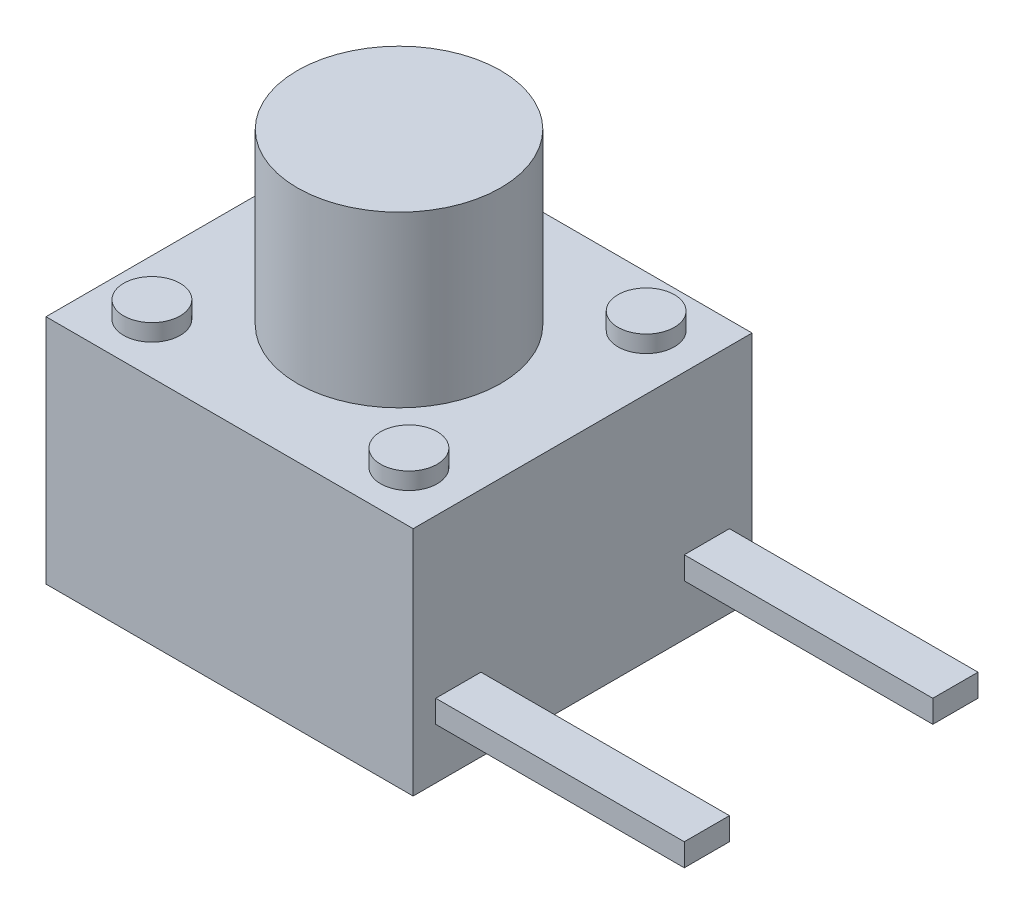
ISO-10303-21;
HEADER;
FILE_DESCRIPTION(('STEP AP214'),'2;1');
FILE_NAME('part.step','',(''),(''),'','','');
FILE_SCHEMA(('AUTOMOTIVE_DESIGN { 1 0 10303 214 1 1 1 1 }'));
ENDSEC;
DATA;
#1=APPLICATION_CONTEXT('core data for automotive mechanical design processes');
#2=APPLICATION_PROTOCOL_DEFINITION('international standard','automotive_design',2000,#1);
#3=PRODUCT_CONTEXT('',#1,'mechanical');
#4=PRODUCT('Part','Part','',(#3));
#5=PRODUCT_RELATED_PRODUCT_CATEGORY('part','',(#4));
#6=PRODUCT_DEFINITION_FORMATION('','',#4);
#7=PRODUCT_DEFINITION_CONTEXT('part definition',#1,'design');
#8=PRODUCT_DEFINITION('design','',#6,#7);
#9=PRODUCT_DEFINITION_SHAPE('','',#8);
#10=(LENGTH_UNIT() NAMED_UNIT(*) SI_UNIT(.MILLI.,.METRE.));
#11=(NAMED_UNIT(*) PLANE_ANGLE_UNIT() SI_UNIT($,.RADIAN.));
#12=(NAMED_UNIT(*) SI_UNIT($,.STERADIAN.) SOLID_ANGLE_UNIT());
#13=UNCERTAINTY_MEASURE_WITH_UNIT(LENGTH_MEASURE(1.E-05),#10,'distance_accuracy_value','');
#14=(GEOMETRIC_REPRESENTATION_CONTEXT(3) GLOBAL_UNCERTAINTY_ASSIGNED_CONTEXT((#13)) GLOBAL_UNIT_ASSIGNED_CONTEXT((#10,
#11,#12)) REPRESENTATION_CONTEXT('',''));
#15=CARTESIAN_POINT('',(0.,0.,0.));
#16=DIRECTION('',(0.,0.,1.));
#17=DIRECTION('',(1.,0.,0.));
#18=AXIS2_PLACEMENT_3D('',#15,#16,#17);
#19=CARTESIAN_POINT('',(-3.25,4.1,3.));
#20=DIRECTION('',(-1.,0.,0.));
#21=DIRECTION('',(0.,0.,1.));
#22=AXIS2_PLACEMENT_3D('',#19,#20,#21);
#23=PLANE('',#22);
#24=DIRECTION('',(0.,0.,-1.));
#25=VECTOR('',#24,1.);
#26=CARTESIAN_POINT('',(-3.25,0.,3.));
#27=LINE('',#26,#25);
#28=CARTESIAN_POINT('',(-3.25,0.,3.));
#29=VERTEX_POINT('',#28);
#30=CARTESIAN_POINT('',(-3.25,0.,-3.));
#31=VERTEX_POINT('',#30);
#32=EDGE_CURVE('E216',#29,#31,#27,.T.);
#33=ORIENTED_EDGE('',*,*,#32,.F.);
#34=DIRECTION('',(0.,-1.,0.));
#35=VECTOR('',#34,1.);
#36=CARTESIAN_POINT('',(-3.25,4.1,3.));
#37=LINE('',#36,#35);
#38=CARTESIAN_POINT('',(-3.25,4.1,3.));
#39=VERTEX_POINT('',#38);
#40=EDGE_CURVE('E42',#39,#29,#37,.T.);
#41=ORIENTED_EDGE('',*,*,#40,.F.);
#42=DIRECTION('',(0.,0.,-1.));
#43=VECTOR('',#42,1.);
#44=CARTESIAN_POINT('',(-3.25,4.1,3.));
#45=LINE('',#44,#43);
#46=CARTESIAN_POINT('',(-3.25,4.1,-3.));
#47=VERTEX_POINT('',#46);
#48=EDGE_CURVE('E218',#39,#47,#45,.T.);
#49=ORIENTED_EDGE('',*,*,#48,.T.);
#50=DIRECTION('',(0.,-1.,0.));
#51=VECTOR('',#50,1.);
#52=CARTESIAN_POINT('',(-3.25,4.1,-3.));
#53=LINE('',#52,#51);
#54=EDGE_CURVE('E37',#47,#31,#53,.T.);
#55=ORIENTED_EDGE('',*,*,#54,.T.);
#56=EDGE_LOOP('',(#33,#41,#49,#55));
#57=FACE_BOUND('',#56,.T.);
#58=ADVANCED_FACE('F34',(#57),#23,.T.);
#59=CARTESIAN_POINT('',(-3.25,4.1,3.));
#60=DIRECTION('',(0.,0.,-1.));
#61=DIRECTION('',(-1.,0.,0.));
#62=AXIS2_PLACEMENT_3D('',#59,#60,#61);
#63=PLANE('',#62);
#64=DIRECTION('',(1.,0.,0.));
#65=VECTOR('',#64,1.);
#66=CARTESIAN_POINT('',(-3.25,0.,3.));
#67=LINE('',#66,#65);
#68=CARTESIAN_POINT('',(3.25,0.,3.));
#69=VERTEX_POINT('',#68);
#70=EDGE_CURVE('E222',#29,#69,#67,.T.);
#71=ORIENTED_EDGE('',*,*,#70,.T.);
#72=DIRECTION('',(0.,-1.,0.));
#73=VECTOR('',#72,1.);
#74=CARTESIAN_POINT('',(3.25,4.1,3.));
#75=LINE('',#74,#73);
#76=CARTESIAN_POINT('',(3.25,4.1,3.));
#77=VERTEX_POINT('',#76);
#78=EDGE_CURVE('E239',#77,#69,#75,.T.);
#79=ORIENTED_EDGE('',*,*,#78,.F.);
#80=DIRECTION('',(1.,0.,0.));
#81=VECTOR('',#80,1.);
#82=CARTESIAN_POINT('',(-3.25,4.1,3.));
#83=LINE('',#82,#81);
#84=EDGE_CURVE('E227',#39,#77,#83,.T.);
#85=ORIENTED_EDGE('',*,*,#84,.F.);
#86=ORIENTED_EDGE('',*,*,#40,.T.);
#87=EDGE_LOOP('',(#71,#79,#85,#86));
#88=FACE_BOUND('',#87,.T.);
#89=ADVANCED_FACE('F256',(#88),#63,.F.);
#90=CARTESIAN_POINT('',(3.25,4.1,3.));
#91=DIRECTION('',(-1.,0.,0.));
#92=DIRECTION('',(0.,0.,1.));
#93=AXIS2_PLACEMENT_3D('',#90,#91,#92);
#94=PLANE('',#93);
#95=DIRECTION('',(0.,0.,-1.));
#96=VECTOR('',#95,1.);
#97=CARTESIAN_POINT('',(3.25,0.899999999999997,-1.8));
#98=LINE('',#97,#96);
#99=CARTESIAN_POINT('',(3.25,0.899999999999997,-1.8));
#100=VERTEX_POINT('',#99);
#101=CARTESIAN_POINT('',(3.25,0.899999999999997,-2.6));
#102=VERTEX_POINT('',#101);
#103=EDGE_CURVE('E132',#100,#102,#98,.T.);
#104=ORIENTED_EDGE('',*,*,#103,.F.);
#105=DIRECTION('',(0.,1.,0.));
#106=VECTOR('',#105,1.);
#107=CARTESIAN_POINT('',(3.25,0.899999999999997,-1.8));
#108=LINE('',#107,#106);
#109=CARTESIAN_POINT('',(3.25,1.3,-1.8));
#110=VERTEX_POINT('',#109);
#111=EDGE_CURVE('E140',#100,#110,#108,.T.);
#112=ORIENTED_EDGE('',*,*,#111,.T.);
#113=DIRECTION('',(0.,0.,-1.));
#114=VECTOR('',#113,1.);
#115=CARTESIAN_POINT('',(3.25,1.3,-1.8));
#116=LINE('',#115,#114);
#117=CARTESIAN_POINT('',(3.25,1.3,-2.6));
#118=VERTEX_POINT('',#117);
#119=EDGE_CURVE('E147',#110,#118,#116,.T.);
#120=ORIENTED_EDGE('',*,*,#119,.T.);
#121=DIRECTION('',(0.,1.,0.));
#122=VECTOR('',#121,1.);
#123=CARTESIAN_POINT('',(3.25,0.899999999999997,-2.6));
#124=LINE('',#123,#122);
#125=EDGE_CURVE('E50',#102,#118,#124,.T.);
#126=ORIENTED_EDGE('',*,*,#125,.F.);
#127=EDGE_LOOP('',(#104,#112,#120,#126));
#128=FACE_BOUND('',#127,.T.);
#129=DIRECTION('',(0.,0.,-1.));
#130=VECTOR('',#129,1.);
#131=CARTESIAN_POINT('',(3.25,0.899999999999997,2.6));
#132=LINE('',#131,#130);
#133=CARTESIAN_POINT('',(3.25,0.899999999999997,2.6));
#134=VERTEX_POINT('',#133);
#135=CARTESIAN_POINT('',(3.25,0.899999999999997,1.8));
#136=VERTEX_POINT('',#135);
#137=EDGE_CURVE('E168',#134,#136,#132,.T.);
#138=ORIENTED_EDGE('',*,*,#137,.F.);
#139=DIRECTION('',(0.,1.,0.));
#140=VECTOR('',#139,1.);
#141=CARTESIAN_POINT('',(3.25,0.899999999999997,2.6));
#142=LINE('',#141,#140);
#143=CARTESIAN_POINT('',(3.25,1.3,2.6));
#144=VERTEX_POINT('',#143);
#145=EDGE_CURVE('E146',#134,#144,#142,.T.);
#146=ORIENTED_EDGE('',*,*,#145,.T.);
#147=DIRECTION('',(0.,0.,-1.));
#148=VECTOR('',#147,1.);
#149=CARTESIAN_POINT('',(3.25,1.3,2.6));
#150=LINE('',#149,#148);
#151=CARTESIAN_POINT('',(3.25,1.3,1.8));
#152=VERTEX_POINT('',#151);
#153=EDGE_CURVE('E178',#144,#152,#150,.T.);
#154=ORIENTED_EDGE('',*,*,#153,.T.);
#155=DIRECTION('',(0.,1.,0.));
#156=VECTOR('',#155,1.);
#157=CARTESIAN_POINT('',(3.25,0.899999999999997,1.8));
#158=LINE('',#157,#156);
#159=EDGE_CURVE('E58',#136,#152,#158,.T.);
#160=ORIENTED_EDGE('',*,*,#159,.F.);
#161=EDGE_LOOP('',(#138,#146,#154,#160));
#162=FACE_BOUND('',#161,.T.);
#163=DIRECTION('',(0.,0.,-1.));
#164=VECTOR('',#163,1.);
#165=CARTESIAN_POINT('',(3.25,0.,3.));
#166=LINE('',#165,#164);
#167=CARTESIAN_POINT('',(3.25,0.,-3.));
#168=VERTEX_POINT('',#167);
#169=EDGE_CURVE('E234',#69,#168,#166,.T.);
#170=ORIENTED_EDGE('',*,*,#169,.T.);
#171=DIRECTION('',(0.,-1.,0.));
#172=VECTOR('',#171,1.);
#173=CARTESIAN_POINT('',(3.25,4.1,-3.));
#174=LINE('',#173,#172);
#175=CARTESIAN_POINT('',(3.25,4.1,-3.));
#176=VERTEX_POINT('',#175);
#177=EDGE_CURVE('E241',#176,#168,#174,.T.);
#178=ORIENTED_EDGE('',*,*,#177,.F.);
#179=DIRECTION('',(0.,0.,-1.));
#180=VECTOR('',#179,1.);
#181=CARTESIAN_POINT('',(3.25,4.1,3.));
#182=LINE('',#181,#180);
#183=EDGE_CURVE('E225',#77,#176,#182,.T.);
#184=ORIENTED_EDGE('',*,*,#183,.F.);
#185=ORIENTED_EDGE('',*,*,#78,.T.);
#186=EDGE_LOOP('',(#170,#178,#184,#185));
#187=FACE_BOUND('',#186,.T.);
#188=ADVANCED_FACE('F149',(#128,#162,#187),#94,.F.);
#189=CARTESIAN_POINT('',(-3.25,4.1,-3.));
#190=DIRECTION('',(0.,0.,-1.));
#191=DIRECTION('',(-1.,0.,0.));
#192=AXIS2_PLACEMENT_3D('',#189,#190,#191);
#193=PLANE('',#192);
#194=DIRECTION('',(1.,0.,0.));
#195=VECTOR('',#194,1.);
#196=CARTESIAN_POINT('',(-3.25,0.,-3.));
#197=LINE('',#196,#195);
#198=EDGE_CURVE('E231',#31,#168,#197,.T.);
#199=ORIENTED_EDGE('',*,*,#198,.F.);
#200=ORIENTED_EDGE('',*,*,#54,.F.);
#201=DIRECTION('',(1.,0.,0.));
#202=VECTOR('',#201,1.);
#203=CARTESIAN_POINT('',(-3.25,4.1,-3.));
#204=LINE('',#203,#202);
#205=EDGE_CURVE('E221',#47,#176,#204,.T.);
#206=ORIENTED_EDGE('',*,*,#205,.T.);
#207=ORIENTED_EDGE('',*,*,#177,.T.);
#208=EDGE_LOOP('',(#199,#200,#206,#207));
#209=FACE_BOUND('',#208,.T.);
#210=ADVANCED_FACE('F249',(#209),#193,.T.);
#211=CARTESIAN_POINT('',(0.,4.1,0.));
#212=DIRECTION('',(0.,-1.,0.));
#213=DIRECTION('',(0.,0.,-1.));
#214=AXIS2_PLACEMENT_3D('',#211,#212,#213);
#215=PLANE('',#214);
#216=CARTESIAN_POINT('',(2.275,4.1,2.1));
#217=DIRECTION('',(0.,-1.,0.));
#218=DIRECTION('',(0.,0.,-1.));
#219=AXIS2_PLACEMENT_3D('',#216,#217,#218);
#220=CIRCLE('',#219,0.5);
#221=CARTESIAN_POINT('',(2.275,4.1,1.6));
#222=VERTEX_POINT('',#221);
#223=EDGE_CURVE('E191',#222,#222,#220,.T.);
#224=ORIENTED_EDGE('',*,*,#223,.T.);
#225=EDGE_LOOP('',(#224));
#226=FACE_BOUND('',#225,.T.);
#227=CARTESIAN_POINT('',(2.275,4.1,-2.1));
#228=DIRECTION('',(0.,-1.,0.));
#229=DIRECTION('',(0.,0.,-1.));
#230=AXIS2_PLACEMENT_3D('',#227,#228,#229);
#231=CIRCLE('',#230,0.5);
#232=CARTESIAN_POINT('',(2.275,4.1,-2.6));
#233=VERTEX_POINT('',#232);
#234=EDGE_CURVE('E197',#233,#233,#231,.T.);
#235=ORIENTED_EDGE('',*,*,#234,.T.);
#236=EDGE_LOOP('',(#235));
#237=FACE_BOUND('',#236,.T.);
#238=CARTESIAN_POINT('',(-2.275,4.1,2.1));
#239=DIRECTION('',(0.,-1.,0.));
#240=DIRECTION('',(0.,0.,-1.));
#241=AXIS2_PLACEMENT_3D('',#238,#239,#240);
#242=CIRCLE('',#241,0.5);
#243=CARTESIAN_POINT('',(-2.275,4.1,1.6));
#244=VERTEX_POINT('',#243);
#245=EDGE_CURVE('E203',#244,#244,#242,.T.);
#246=ORIENTED_EDGE('',*,*,#245,.T.);
#247=EDGE_LOOP('',(#246));
#248=FACE_BOUND('',#247,.T.);
#249=CARTESIAN_POINT('',(-2.275,4.1,-2.1));
#250=DIRECTION('',(0.,-1.,0.));
#251=DIRECTION('',(0.,0.,-1.));
#252=AXIS2_PLACEMENT_3D('',#249,#250,#251);
#253=CIRCLE('',#252,0.5);
#254=CARTESIAN_POINT('',(-2.275,4.1,-2.6));
#255=VERTEX_POINT('',#254);
#256=EDGE_CURVE('E206',#255,#255,#253,.T.);
#257=ORIENTED_EDGE('',*,*,#256,.T.);
#258=EDGE_LOOP('',(#257));
#259=FACE_BOUND('',#258,.T.);
#260=CARTESIAN_POINT('',(0.,4.1,0.));
#261=DIRECTION('',(0.,-1.,0.));
#262=DIRECTION('',(0.,0.,-1.));
#263=AXIS2_PLACEMENT_3D('',#260,#261,#262);
#264=CIRCLE('',#263,1.8);
#265=CARTESIAN_POINT('',(0.,4.1,-1.8));
#266=VERTEX_POINT('',#265);
#267=EDGE_CURVE('E11',#266,#266,#264,.F.);
#268=ORIENTED_EDGE('',*,*,#267,.F.);
#269=EDGE_LOOP('',(#268));
#270=FACE_BOUND('',#269,.T.);
#271=ORIENTED_EDGE('',*,*,#48,.F.);
#272=ORIENTED_EDGE('',*,*,#84,.T.);
#273=ORIENTED_EDGE('',*,*,#183,.T.);
#274=ORIENTED_EDGE('',*,*,#205,.F.);
#275=EDGE_LOOP('',(#271,#272,#273,#274));
#276=FACE_BOUND('',#275,.T.);
#277=ADVANCED_FACE('F261',(#226,#237,#248,#259,#270,#276),#215,.F.);
#278=CARTESIAN_POINT('',(0.,0.,0.));
#279=DIRECTION('',(0.,-1.,0.));
#280=DIRECTION('',(0.,0.,-1.));
#281=AXIS2_PLACEMENT_3D('',#278,#279,#280);
#282=PLANE('',#281);
#283=ORIENTED_EDGE('',*,*,#32,.T.);
#284=ORIENTED_EDGE('',*,*,#198,.T.);
#285=ORIENTED_EDGE('',*,*,#169,.F.);
#286=ORIENTED_EDGE('',*,*,#70,.F.);
#287=EDGE_LOOP('',(#283,#284,#285,#286));
#288=FACE_BOUND('',#287,.T.);
#289=ADVANCED_FACE('F253',(#288),#282,.T.);
#290=CARTESIAN_POINT('',(0.,7.1,0.));
#291=DIRECTION('',(0.,-1.,0.));
#292=DIRECTION('',(0.,0.,-1.));
#293=AXIS2_PLACEMENT_3D('',#290,#291,#292);
#294=CYLINDRICAL_SURFACE('',#293,1.8);
#295=CARTESIAN_POINT('',(0.,7.1,0.));
#296=DIRECTION('',(0.,1.,0.));
#297=DIRECTION('',(0.,0.,1.));
#298=AXIS2_PLACEMENT_3D('',#295,#296,#297);
#299=CIRCLE('',#298,1.8);
#300=CARTESIAN_POINT('',(0.,7.1,1.8));
#301=VERTEX_POINT('',#300);
#302=EDGE_CURVE('E212',#301,#301,#299,.T.);
#303=ORIENTED_EDGE('',*,*,#302,.F.);
#304=EDGE_LOOP('',(#303));
#305=FACE_BOUND('',#304,.T.);
#306=ORIENTED_EDGE('',*,*,#267,.T.);
#307=EDGE_LOOP('',(#306));
#308=FACE_BOUND('',#307,.T.);
#309=ADVANCED_FACE('F269',(#305,#308),#294,.T.);
#310=CARTESIAN_POINT('',(0.,7.1,0.));
#311=DIRECTION('',(0.,1.,0.));
#312=DIRECTION('',(0.,0.,1.));
#313=AXIS2_PLACEMENT_3D('',#310,#311,#312);
#314=PLANE('',#313);
#315=ORIENTED_EDGE('',*,*,#302,.T.);
#316=EDGE_LOOP('',(#315));
#317=FACE_BOUND('',#316,.T.);
#318=ADVANCED_FACE('F308',(#317),#314,.T.);
#319=CARTESIAN_POINT('',(-2.275,4.4,-2.1));
#320=DIRECTION('',(0.,-1.,0.));
#321=DIRECTION('',(0.,0.,-1.));
#322=AXIS2_PLACEMENT_3D('',#319,#320,#321);
#323=CYLINDRICAL_SURFACE('',#322,0.5);
#324=CARTESIAN_POINT('',(-2.275,4.4,-2.1));
#325=DIRECTION('',(0.,-1.,0.));
#326=DIRECTION('',(0.,0.,-1.));
#327=AXIS2_PLACEMENT_3D('',#324,#325,#326);
#328=CIRCLE('',#327,0.5);
#329=CARTESIAN_POINT('',(-2.275,4.4,-2.6));
#330=VERTEX_POINT('',#329);
#331=EDGE_CURVE('E209',#330,#330,#328,.T.);
#332=ORIENTED_EDGE('',*,*,#331,.T.);
#333=EDGE_LOOP('',(#332));
#334=FACE_BOUND('',#333,.T.);
#335=ORIENTED_EDGE('',*,*,#256,.F.);
#336=EDGE_LOOP('',(#335));
#337=FACE_BOUND('',#336,.T.);
#338=ADVANCED_FACE('F316',(#334,#337),#323,.T.);
#339=CARTESIAN_POINT('',(-2.275,4.4,-2.1));
#340=DIRECTION('',(0.,-1.,0.));
#341=DIRECTION('',(0.,0.,-1.));
#342=AXIS2_PLACEMENT_3D('',#339,#340,#341);
#343=PLANE('',#342);
#344=ORIENTED_EDGE('',*,*,#331,.F.);
#345=EDGE_LOOP('',(#344));
#346=FACE_BOUND('',#345,.T.);
#347=ADVANCED_FACE('F330',(#346),#343,.F.);
#348=CARTESIAN_POINT('',(-2.275,4.4,2.1));
#349=DIRECTION('',(0.,-1.,0.));
#350=DIRECTION('',(0.,0.,-1.));
#351=AXIS2_PLACEMENT_3D('',#348,#349,#350);
#352=CYLINDRICAL_SURFACE('',#351,0.5);
#353=CARTESIAN_POINT('',(-2.275,4.4,2.1));
#354=DIRECTION('',(0.,-1.,0.));
#355=DIRECTION('',(0.,0.,-1.));
#356=AXIS2_PLACEMENT_3D('',#353,#354,#355);
#357=CIRCLE('',#356,0.5);
#358=CARTESIAN_POINT('',(-2.275,4.4,1.6));
#359=VERTEX_POINT('',#358);
#360=EDGE_CURVE('E200',#359,#359,#357,.T.);
#361=ORIENTED_EDGE('',*,*,#360,.T.);
#362=EDGE_LOOP('',(#361));
#363=FACE_BOUND('',#362,.T.);
#364=ORIENTED_EDGE('',*,*,#245,.F.);
#365=EDGE_LOOP('',(#364));
#366=FACE_BOUND('',#365,.T.);
#367=ADVANCED_FACE('F340',(#363,#366),#352,.T.);
#368=CARTESIAN_POINT('',(-2.275,4.4,2.1));
#369=DIRECTION('',(0.,-1.,0.));
#370=DIRECTION('',(0.,0.,-1.));
#371=AXIS2_PLACEMENT_3D('',#368,#369,#370);
#372=PLANE('',#371);
#373=ORIENTED_EDGE('',*,*,#360,.F.);
#374=EDGE_LOOP('',(#373));
#375=FACE_BOUND('',#374,.T.);
#376=ADVANCED_FACE('F350',(#375),#372,.F.);
#377=CARTESIAN_POINT('',(2.275,4.4,-2.1));
#378=DIRECTION('',(0.,-1.,0.));
#379=DIRECTION('',(0.,0.,-1.));
#380=AXIS2_PLACEMENT_3D('',#377,#378,#379);
#381=CYLINDRICAL_SURFACE('',#380,0.5);
#382=CARTESIAN_POINT('',(2.275,4.4,-2.1));
#383=DIRECTION('',(0.,-1.,0.));
#384=DIRECTION('',(0.,0.,-1.));
#385=AXIS2_PLACEMENT_3D('',#382,#383,#384);
#386=CIRCLE('',#385,0.5);
#387=CARTESIAN_POINT('',(2.275,4.4,-2.6));
#388=VERTEX_POINT('',#387);
#389=EDGE_CURVE('E194',#388,#388,#386,.T.);
#390=ORIENTED_EDGE('',*,*,#389,.T.);
#391=EDGE_LOOP('',(#390));
#392=FACE_BOUND('',#391,.T.);
#393=ORIENTED_EDGE('',*,*,#234,.F.);
#394=EDGE_LOOP('',(#393));
#395=FACE_BOUND('',#394,.T.);
#396=ADVANCED_FACE('F360',(#392,#395),#381,.T.);
#397=CARTESIAN_POINT('',(2.275,4.4,-2.1));
#398=DIRECTION('',(0.,-1.,0.));
#399=DIRECTION('',(0.,0.,-1.));
#400=AXIS2_PLACEMENT_3D('',#397,#398,#399);
#401=PLANE('',#400);
#402=ORIENTED_EDGE('',*,*,#389,.F.);
#403=EDGE_LOOP('',(#402));
#404=FACE_BOUND('',#403,.T.);
#405=ADVANCED_FACE('F370',(#404),#401,.F.);
#406=CARTESIAN_POINT('',(2.275,4.4,2.1));
#407=DIRECTION('',(0.,-1.,0.));
#408=DIRECTION('',(0.,0.,-1.));
#409=AXIS2_PLACEMENT_3D('',#406,#407,#408);
#410=CYLINDRICAL_SURFACE('',#409,0.5);
#411=CARTESIAN_POINT('',(2.275,4.4,2.1));
#412=DIRECTION('',(0.,-1.,0.));
#413=DIRECTION('',(0.,0.,-1.));
#414=AXIS2_PLACEMENT_3D('',#411,#412,#413);
#415=CIRCLE('',#414,0.5);
#416=CARTESIAN_POINT('',(2.275,4.4,1.6));
#417=VERTEX_POINT('',#416);
#418=EDGE_CURVE('E185',#417,#417,#415,.T.);
#419=ORIENTED_EDGE('',*,*,#418,.T.);
#420=EDGE_LOOP('',(#419));
#421=FACE_BOUND('',#420,.T.);
#422=ORIENTED_EDGE('',*,*,#223,.F.);
#423=EDGE_LOOP('',(#422));
#424=FACE_BOUND('',#423,.T.);
#425=ADVANCED_FACE('F380',(#421,#424),#410,.T.);
#426=CARTESIAN_POINT('',(2.275,4.4,2.1));
#427=DIRECTION('',(0.,-1.,0.));
#428=DIRECTION('',(0.,0.,-1.));
#429=AXIS2_PLACEMENT_3D('',#426,#427,#428);
#430=PLANE('',#429);
#431=ORIENTED_EDGE('',*,*,#418,.F.);
#432=EDGE_LOOP('',(#431));
#433=FACE_BOUND('',#432,.T.);
#434=ADVANCED_FACE('F389',(#433),#430,.F.);
#435=CARTESIAN_POINT('',(7.65,0.899999999999997,2.6));
#436=DIRECTION('',(0.,0.,1.));
#437=DIRECTION('',(0.,-1.,0.));
#438=AXIS2_PLACEMENT_3D('',#435,#436,#437);
#439=PLANE('',#438);
#440=ORIENTED_EDGE('',*,*,#145,.F.);
#441=DIRECTION('',(-1.,0.,0.));
#442=VECTOR('',#441,1.);
#443=CARTESIAN_POINT('',(7.65,0.899999999999997,2.6));
#444=LINE('',#443,#442);
#445=CARTESIAN_POINT('',(7.65,0.899999999999997,2.6));
#446=VERTEX_POINT('',#445);
#447=EDGE_CURVE('E183',#446,#134,#444,.T.);
#448=ORIENTED_EDGE('',*,*,#447,.F.);
#449=DIRECTION('',(0.,1.,0.));
#450=VECTOR('',#449,1.);
#451=CARTESIAN_POINT('',(7.65,0.899999999999997,2.6));
#452=LINE('',#451,#450);
#453=CARTESIAN_POINT('',(7.65,1.3,2.6));
#454=VERTEX_POINT('',#453);
#455=EDGE_CURVE('E164',#446,#454,#452,.T.);
#456=ORIENTED_EDGE('',*,*,#455,.T.);
#457=DIRECTION('',(-1.,0.,0.));
#458=VECTOR('',#457,1.);
#459=CARTESIAN_POINT('',(7.65,1.3,2.6));
#460=LINE('',#459,#458);
#461=EDGE_CURVE('E175',#454,#144,#460,.T.);
#462=ORIENTED_EDGE('',*,*,#461,.T.);
#463=EDGE_LOOP('',(#440,#448,#456,#462));
#464=FACE_BOUND('',#463,.T.);
#465=ADVANCED_FACE('F398',(#464),#439,.T.);
#466=CARTESIAN_POINT('',(7.65,0.899999999999997,2.6));
#467=DIRECTION('',(0.,1.,0.));
#468=DIRECTION('',(0.,0.,1.));
#469=AXIS2_PLACEMENT_3D('',#466,#467,#468);
#470=PLANE('',#469);
#471=ORIENTED_EDGE('',*,*,#137,.T.);
#472=DIRECTION('',(-1.,0.,0.));
#473=VECTOR('',#472,1.);
#474=CARTESIAN_POINT('',(7.65,0.899999999999997,1.8));
#475=LINE('',#474,#473);
#476=CARTESIAN_POINT('',(7.65,0.899999999999997,1.8));
#477=VERTEX_POINT('',#476);
#478=EDGE_CURVE('E186',#477,#136,#475,.T.);
#479=ORIENTED_EDGE('',*,*,#478,.F.);
#480=DIRECTION('',(0.,0.,-1.));
#481=VECTOR('',#480,1.);
#482=CARTESIAN_POINT('',(7.65,0.899999999999997,2.6));
#483=LINE('',#482,#481);
#484=EDGE_CURVE('E173',#446,#477,#483,.T.);
#485=ORIENTED_EDGE('',*,*,#484,.F.);
#486=ORIENTED_EDGE('',*,*,#447,.T.);
#487=EDGE_LOOP('',(#471,#479,#485,#486));
#488=FACE_BOUND('',#487,.T.);
#489=ADVANCED_FACE('F408',(#488),#470,.F.);
#490=CARTESIAN_POINT('',(7.65,0.899999999999997,1.8));
#491=DIRECTION('',(0.,0.,1.));
#492=DIRECTION('',(0.,-1.,0.));
#493=AXIS2_PLACEMENT_3D('',#490,#491,#492);
#494=PLANE('',#493);
#495=ORIENTED_EDGE('',*,*,#159,.T.);
#496=DIRECTION('',(-1.,0.,0.));
#497=VECTOR('',#496,1.);
#498=CARTESIAN_POINT('',(7.65,1.3,1.8));
#499=LINE('',#498,#497);
#500=CARTESIAN_POINT('',(7.65,1.3,1.8));
#501=VERTEX_POINT('',#500);
#502=EDGE_CURVE('E188',#501,#152,#499,.T.);
#503=ORIENTED_EDGE('',*,*,#502,.F.);
#504=DIRECTION('',(0.,1.,0.));
#505=VECTOR('',#504,1.);
#506=CARTESIAN_POINT('',(7.65,0.899999999999997,1.8));
#507=LINE('',#506,#505);
#508=EDGE_CURVE('E171',#477,#501,#507,.T.);
#509=ORIENTED_EDGE('',*,*,#508,.F.);
#510=ORIENTED_EDGE('',*,*,#478,.T.);
#511=EDGE_LOOP('',(#495,#503,#509,#510));
#512=FACE_BOUND('',#511,.T.);
#513=ADVANCED_FACE('F415',(#512),#494,.F.);
#514=CARTESIAN_POINT('',(7.65,1.3,2.6));
#515=DIRECTION('',(0.,1.,0.));
#516=DIRECTION('',(0.,0.,1.));
#517=AXIS2_PLACEMENT_3D('',#514,#515,#516);
#518=PLANE('',#517);
#519=ORIENTED_EDGE('',*,*,#153,.F.);
#520=ORIENTED_EDGE('',*,*,#461,.F.);
#521=DIRECTION('',(0.,0.,-1.));
#522=VECTOR('',#521,1.);
#523=CARTESIAN_POINT('',(7.65,1.3,2.6));
#524=LINE('',#523,#522);
#525=EDGE_CURVE('E167',#454,#501,#524,.T.);
#526=ORIENTED_EDGE('',*,*,#525,.T.);
#527=ORIENTED_EDGE('',*,*,#502,.T.);
#528=EDGE_LOOP('',(#519,#520,#526,#527));
#529=FACE_BOUND('',#528,.T.);
#530=ADVANCED_FACE('F423',(#529),#518,.T.);
#531=CARTESIAN_POINT('',(7.65,0.,0.));
#532=DIRECTION('',(-1.,0.,0.));
#533=DIRECTION('',(0.,0.,1.));
#534=AXIS2_PLACEMENT_3D('',#531,#532,#533);
#535=PLANE('',#534);
#536=ORIENTED_EDGE('',*,*,#455,.F.);
#537=ORIENTED_EDGE('',*,*,#484,.T.);
#538=ORIENTED_EDGE('',*,*,#508,.T.);
#539=ORIENTED_EDGE('',*,*,#525,.F.);
#540=EDGE_LOOP('',(#536,#537,#538,#539));
#541=FACE_BOUND('',#540,.T.);
#542=ADVANCED_FACE('F430',(#541),#535,.F.);
#543=CARTESIAN_POINT('',(7.65,0.899999999999997,-1.8));
#544=DIRECTION('',(0.,0.,1.));
#545=DIRECTION('',(0.,-1.,0.));
#546=AXIS2_PLACEMENT_3D('',#543,#544,#545);
#547=PLANE('',#546);
#548=ORIENTED_EDGE('',*,*,#111,.F.);
#549=DIRECTION('',(-1.,0.,0.));
#550=VECTOR('',#549,1.);
#551=CARTESIAN_POINT('',(7.65,0.899999999999997,-1.8));
#552=LINE('',#551,#550);
#553=CARTESIAN_POINT('',(7.65,0.899999999999997,-1.8));
#554=VERTEX_POINT('',#553);
#555=EDGE_CURVE('E127',#554,#100,#552,.T.);
#556=ORIENTED_EDGE('',*,*,#555,.F.);
#557=DIRECTION('',(0.,1.,0.));
#558=VECTOR('',#557,1.);
#559=CARTESIAN_POINT('',(7.65,0.899999999999997,-1.8));
#560=LINE('',#559,#558);
#561=CARTESIAN_POINT('',(7.65,1.3,-1.8));
#562=VERTEX_POINT('',#561);
#563=EDGE_CURVE('E151',#554,#562,#560,.T.);
#564=ORIENTED_EDGE('',*,*,#563,.T.);
#565=DIRECTION('',(-1.,0.,0.));
#566=VECTOR('',#565,1.);
#567=CARTESIAN_POINT('',(7.65,1.3,-1.8));
#568=LINE('',#567,#566);
#569=EDGE_CURVE('E142',#562,#110,#568,.T.);
#570=ORIENTED_EDGE('',*,*,#569,.T.);
#571=EDGE_LOOP('',(#548,#556,#564,#570));
#572=FACE_BOUND('',#571,.T.);
#573=ADVANCED_FACE('F141',(#572),#547,.T.);
#574=CARTESIAN_POINT('',(7.65,0.899999999999997,-1.8));
#575=DIRECTION('',(0.,1.,0.));
#576=DIRECTION('',(0.,0.,1.));
#577=AXIS2_PLACEMENT_3D('',#574,#575,#576);
#578=PLANE('',#577);
#579=ORIENTED_EDGE('',*,*,#103,.T.);
#580=DIRECTION('',(-1.,0.,0.));
#581=VECTOR('',#580,1.);
#582=CARTESIAN_POINT('',(7.65,0.899999999999997,-2.6));
#583=LINE('',#582,#581);
#584=CARTESIAN_POINT('',(7.65,0.899999999999997,-2.6));
#585=VERTEX_POINT('',#584);
#586=EDGE_CURVE('E137',#585,#102,#583,.T.);
#587=ORIENTED_EDGE('',*,*,#586,.F.);
#588=DIRECTION('',(0.,0.,-1.));
#589=VECTOR('',#588,1.);
#590=CARTESIAN_POINT('',(7.65,0.899999999999997,-1.8));
#591=LINE('',#590,#589);
#592=EDGE_CURVE('E133',#554,#585,#591,.T.);
#593=ORIENTED_EDGE('',*,*,#592,.F.);
#594=ORIENTED_EDGE('',*,*,#555,.T.);
#595=EDGE_LOOP('',(#579,#587,#593,#594));
#596=FACE_BOUND('',#595,.T.);
#597=ADVANCED_FACE('F129',(#596),#578,.F.);
#598=CARTESIAN_POINT('',(7.65,0.899999999999997,-2.6));
#599=DIRECTION('',(0.,0.,1.));
#600=DIRECTION('',(0.,-1.,0.));
#601=AXIS2_PLACEMENT_3D('',#598,#599,#600);
#602=PLANE('',#601);
#603=ORIENTED_EDGE('',*,*,#125,.T.);
#604=DIRECTION('',(-1.,0.,0.));
#605=VECTOR('',#604,1.);
#606=CARTESIAN_POINT('',(7.65,1.3,-2.6));
#607=LINE('',#606,#605);
#608=CARTESIAN_POINT('',(7.65,1.3,-2.6));
#609=VERTEX_POINT('',#608);
#610=EDGE_CURVE('E498',#609,#118,#607,.T.);
#611=ORIENTED_EDGE('',*,*,#610,.F.);
#612=DIRECTION('',(0.,1.,0.));
#613=VECTOR('',#612,1.);
#614=CARTESIAN_POINT('',(7.65,0.899999999999997,-2.6));
#615=LINE('',#614,#613);
#616=EDGE_CURVE('E160',#585,#609,#615,.T.);
#617=ORIENTED_EDGE('',*,*,#616,.F.);
#618=ORIENTED_EDGE('',*,*,#586,.T.);
#619=EDGE_LOOP('',(#603,#611,#617,#618));
#620=FACE_BOUND('',#619,.T.);
#621=ADVANCED_FACE('F451',(#620),#602,.F.);
#622=CARTESIAN_POINT('',(7.65,1.3,-1.8));
#623=DIRECTION('',(0.,1.,0.));
#624=DIRECTION('',(0.,0.,1.));
#625=AXIS2_PLACEMENT_3D('',#622,#623,#624);
#626=PLANE('',#625);
#627=ORIENTED_EDGE('',*,*,#119,.F.);
#628=ORIENTED_EDGE('',*,*,#569,.F.);
#629=DIRECTION('',(0.,0.,-1.));
#630=VECTOR('',#629,1.);
#631=CARTESIAN_POINT('',(7.65,1.3,-1.8));
#632=LINE('',#631,#630);
#633=EDGE_CURVE('E154',#562,#609,#632,.T.);
#634=ORIENTED_EDGE('',*,*,#633,.T.);
#635=ORIENTED_EDGE('',*,*,#610,.T.);
#636=EDGE_LOOP('',(#627,#628,#634,#635));
#637=FACE_BOUND('',#636,.T.);
#638=ADVANCED_FACE('F458',(#637),#626,.T.);
#639=CARTESIAN_POINT('',(7.65,0.,0.));
#640=DIRECTION('',(-1.,0.,0.));
#641=DIRECTION('',(0.,0.,1.));
#642=AXIS2_PLACEMENT_3D('',#639,#640,#641);
#643=PLANE('',#642);
#644=ORIENTED_EDGE('',*,*,#563,.F.);
#645=ORIENTED_EDGE('',*,*,#592,.T.);
#646=ORIENTED_EDGE('',*,*,#616,.T.);
#647=ORIENTED_EDGE('',*,*,#633,.F.);
#648=EDGE_LOOP('',(#644,#645,#646,#647));
#649=FACE_BOUND('',#648,.T.);
#650=ADVANCED_FACE('F465',(#649),#643,.F.);
#651=CLOSED_SHELL('',(#58,#89,#188,#210,#277,#289,#309,#318,#338,#347,#367,#376,#396,#405,#425,
#434,#465,#489,#513,#530,#542,#573,#597,#621,#638,#650));
#652=MANIFOLD_SOLID_BREP('B2',#651);
#653=ADVANCED_BREP_SHAPE_REPRESENTATION('',(#18,#652),#14);
#654=SHAPE_DEFINITION_REPRESENTATION(#9,#653);
ENDSEC;
END-ISO-10303-21;
